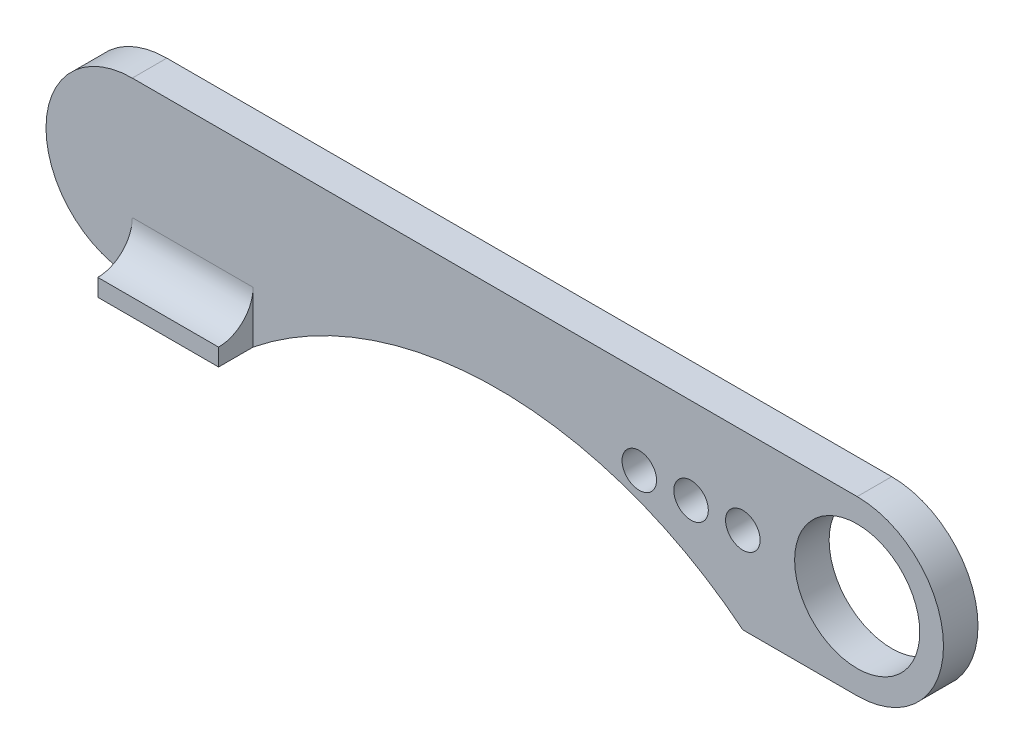
ISO-10303-21;
HEADER;
FILE_DESCRIPTION(('STEP AP214'),'2;1');
FILE_NAME('part.step','',(''),(''),'','','');
FILE_SCHEMA(('AUTOMOTIVE_DESIGN { 1 0 10303 214 1 1 1 1 }'));
ENDSEC;
DATA;
#1=APPLICATION_CONTEXT('core data for automotive mechanical design processes');
#2=APPLICATION_PROTOCOL_DEFINITION('international standard','automotive_design',2000,#1);
#3=PRODUCT_CONTEXT('',#1,'mechanical');
#4=PRODUCT('Part','Part','',(#3));
#5=PRODUCT_RELATED_PRODUCT_CATEGORY('part','',(#4));
#6=PRODUCT_DEFINITION_FORMATION('','',#4);
#7=PRODUCT_DEFINITION_CONTEXT('part definition',#1,'design');
#8=PRODUCT_DEFINITION('design','',#6,#7);
#9=PRODUCT_DEFINITION_SHAPE('','',#8);
#10=(LENGTH_UNIT() NAMED_UNIT(*) SI_UNIT(.MILLI.,.METRE.));
#11=(NAMED_UNIT(*) PLANE_ANGLE_UNIT() SI_UNIT($,.RADIAN.));
#12=(NAMED_UNIT(*) SI_UNIT($,.STERADIAN.) SOLID_ANGLE_UNIT());
#13=UNCERTAINTY_MEASURE_WITH_UNIT(LENGTH_MEASURE(1.E-05),#10,'distance_accuracy_value','');
#14=(GEOMETRIC_REPRESENTATION_CONTEXT(3) GLOBAL_UNCERTAINTY_ASSIGNED_CONTEXT((#13)) GLOBAL_UNIT_ASSIGNED_CONTEXT((#10,
#11,#12)) REPRESENTATION_CONTEXT('',''));
#15=CARTESIAN_POINT('',(0.,0.,0.));
#16=DIRECTION('',(0.,0.,1.));
#17=DIRECTION('',(1.,0.,0.));
#18=AXIS2_PLACEMENT_3D('',#15,#16,#17);
#19=CARTESIAN_POINT('',(-42.,-5.,2.));
#20=DIRECTION('',(0.,1.,0.));
#21=DIRECTION('',(-1.,0.,0.));
#22=AXIS2_PLACEMENT_3D('',#19,#20,#21);
#23=PLANE('',#22);
#24=DIRECTION('',(0.,0.,-1.));
#25=VECTOR('',#24,1.);
#26=CARTESIAN_POINT('',(-6.625,-5.,30.8121610609132));
#27=LINE('',#26,#25);
#28=CARTESIAN_POINT('',(-6.625,-5.,2.));
#29=VERTEX_POINT('',#28);
#30=CARTESIAN_POINT('',(-6.625,-5.,0.));
#31=VERTEX_POINT('',#30);
#32=EDGE_CURVE('E220',#29,#31,#27,.T.);
#33=ORIENTED_EDGE('',*,*,#32,.T.);
#34=DIRECTION('',(1.,0.,0.));
#35=VECTOR('',#34,1.);
#36=CARTESIAN_POINT('',(-42.,-5.,0.));
#37=LINE('',#36,#35);
#38=CARTESIAN_POINT('',(0.,-5.,0.));
#39=VERTEX_POINT('',#38);
#40=EDGE_CURVE('E245',#31,#39,#37,.T.);
#41=ORIENTED_EDGE('',*,*,#40,.T.);
#42=DIRECTION('',(0.,0.,-1.));
#43=VECTOR('',#42,1.);
#44=CARTESIAN_POINT('',(0.,-5.,2.));
#45=LINE('',#44,#43);
#46=CARTESIAN_POINT('',(0.,-5.,2.));
#47=VERTEX_POINT('',#46);
#48=EDGE_CURVE('E81',#47,#39,#45,.T.);
#49=ORIENTED_EDGE('',*,*,#48,.F.);
#50=DIRECTION('',(1.,0.,0.));
#51=VECTOR('',#50,1.);
#52=CARTESIAN_POINT('',(-42.,-5.,2.));
#53=LINE('',#52,#51);
#54=EDGE_CURVE('E231',#29,#47,#53,.T.);
#55=ORIENTED_EDGE('',*,*,#54,.F.);
#56=EDGE_LOOP('',(#33,#41,#49,#55));
#57=FACE_BOUND('',#56,.T.);
#58=ADVANCED_FACE('F72',(#57),#23,.F.);
#59=DIRECTION('',(0.,0.,-1.));
#60=VECTOR('',#59,1.);
#61=CARTESIAN_POINT('',(-35.,-5.,30.8121610609132));
#62=LINE('',#61,#60);
#63=CARTESIAN_POINT('',(-35.,-5.,2.));
#64=VERTEX_POINT('',#63);
#65=CARTESIAN_POINT('',(-35.,-5.00000000000001,0.));
#66=VERTEX_POINT('',#65);
#67=EDGE_CURVE('E96',#64,#66,#62,.T.);
#68=ORIENTED_EDGE('',*,*,#67,.F.);
#69=DIRECTION('',(0.,0.,1.));
#70=VECTOR('',#69,1.);
#71=CARTESIAN_POINT('',(-35.,-5.,0.));
#72=LINE('',#71,#70);
#73=CARTESIAN_POINT('',(-35.,-5.,4.));
#74=VERTEX_POINT('',#73);
#75=EDGE_CURVE('E294',#64,#74,#72,.T.);
#76=ORIENTED_EDGE('',*,*,#75,.T.);
#77=DIRECTION('',(-1.,0.,0.));
#78=VECTOR('',#77,1.);
#79=CARTESIAN_POINT('',(-42.,-5.,4.));
#80=LINE('',#79,#78);
#81=CARTESIAN_POINT('',(-42.,-5.,4.));
#82=VERTEX_POINT('',#81);
#83=EDGE_CURVE('E174',#74,#82,#80,.T.);
#84=ORIENTED_EDGE('',*,*,#83,.T.);
#85=DIRECTION('',(0.,0.,-1.));
#86=VECTOR('',#85,1.);
#87=CARTESIAN_POINT('',(-42.,-5.,0.));
#88=LINE('',#87,#86);
#89=CARTESIAN_POINT('',(-42.,-5.,2.));
#90=VERTEX_POINT('',#89);
#91=EDGE_CURVE('E161',#82,#90,#88,.T.);
#92=ORIENTED_EDGE('',*,*,#91,.T.);
#93=DIRECTION('',(0.,0.,-1.));
#94=VECTOR('',#93,1.);
#95=CARTESIAN_POINT('',(-42.,-5.,2.));
#96=LINE('',#95,#94);
#97=CARTESIAN_POINT('',(-42.,-5.,0.));
#98=VERTEX_POINT('',#97);
#99=EDGE_CURVE('E12',#90,#98,#96,.T.);
#100=ORIENTED_EDGE('',*,*,#99,.T.);
#101=EDGE_CURVE('E246',#98,#66,#37,.T.);
#102=ORIENTED_EDGE('',*,*,#101,.T.);
#103=EDGE_LOOP('',(#68,#76,#84,#92,#100,#102));
#104=FACE_BOUND('',#103,.T.);
#105=ADVANCED_FACE('F291',(#104),#23,.F.);
#106=CARTESIAN_POINT('',(-42.,0.,2.));
#107=DIRECTION('',(0.,0.,1.));
#108=DIRECTION('',(1.,0.,0.));
#109=AXIS2_PLACEMENT_3D('',#106,#107,#108);
#110=PLANE('',#109);
#111=DIRECTION('',(0.,-1.,0.));
#112=VECTOR('',#111,1.);
#113=CARTESIAN_POINT('',(-42.,0.,2.));
#114=LINE('',#113,#112);
#115=CARTESIAN_POINT('',(-42.,-2.,2.));
#116=VERTEX_POINT('',#115);
#117=EDGE_CURVE('E172',#116,#90,#114,.T.);
#118=ORIENTED_EDGE('',*,*,#117,.F.);
#119=DIRECTION('',(-1.,0.,0.));
#120=VECTOR('',#119,1.);
#121=CARTESIAN_POINT('',(-42.,-2.,2.));
#122=LINE('',#121,#120);
#123=CARTESIAN_POINT('',(-35.,-2.,2.));
#124=VERTEX_POINT('',#123);
#125=EDGE_CURVE('E146',#124,#116,#122,.T.);
#126=ORIENTED_EDGE('',*,*,#125,.F.);
#127=DIRECTION('',(0.,1.,0.));
#128=VECTOR('',#127,1.);
#129=CARTESIAN_POINT('',(-35.,0.,2.));
#130=LINE('',#129,#128);
#131=EDGE_CURVE('E167',#64,#124,#130,.T.);
#132=ORIENTED_EDGE('',*,*,#131,.F.);
#133=CARTESIAN_POINT('',(-20.8125,-22.628515625,2.));
#134=DIRECTION('',(0.,0.,1.));
#135=DIRECTION('',(1.,0.,0.));
#136=AXIS2_PLACEMENT_3D('',#133,#134,#135);
#137=CIRCLE('',#136,22.628515625);
#138=EDGE_CURVE('E193',#29,#64,#137,.T.);
#139=ORIENTED_EDGE('',*,*,#138,.F.);
#140=ORIENTED_EDGE('',*,*,#54,.T.);
#141=CARTESIAN_POINT('',(0.,0.,2.));
#142=DIRECTION('',(0.,0.,1.));
#143=DIRECTION('',(1.,0.,0.));
#144=AXIS2_PLACEMENT_3D('',#141,#142,#143);
#145=CIRCLE('',#144,5.);
#146=CARTESIAN_POINT('',(0.,5.,2.));
#147=VERTEX_POINT('',#146);
#148=EDGE_CURVE('E235',#47,#147,#145,.T.);
#149=ORIENTED_EDGE('',*,*,#148,.T.);
#150=DIRECTION('',(-1.,0.,0.));
#151=VECTOR('',#150,1.);
#152=CARTESIAN_POINT('',(-42.,5.,2.));
#153=LINE('',#152,#151);
#154=CARTESIAN_POINT('',(-42.,5.,2.));
#155=VERTEX_POINT('',#154);
#156=EDGE_CURVE('E238',#147,#155,#153,.T.);
#157=ORIENTED_EDGE('',*,*,#156,.T.);
#158=CARTESIAN_POINT('',(-42.,0.,2.));
#159=DIRECTION('',(0.,0.,1.));
#160=DIRECTION('',(1.,0.,0.));
#161=AXIS2_PLACEMENT_3D('',#158,#159,#160);
#162=CIRCLE('',#161,5.);
#163=EDGE_CURVE('E228',#155,#90,#162,.T.);
#164=ORIENTED_EDGE('',*,*,#163,.T.);
#165=EDGE_LOOP('',(#118,#126,#132,#139,#140,#149,#157,#164));
#166=FACE_BOUND('',#165,.T.);
#167=CARTESIAN_POINT('',(0.,0.,2.));
#168=DIRECTION('',(0.,0.,1.));
#169=DIRECTION('',(1.,0.,0.));
#170=AXIS2_PLACEMENT_3D('',#167,#168,#169);
#171=CIRCLE('',#170,3.625);
#172=CARTESIAN_POINT('',(3.625,0.,2.));
#173=VERTEX_POINT('',#172);
#174=EDGE_CURVE('E184',#173,#173,#171,.F.);
#175=ORIENTED_EDGE('',*,*,#174,.T.);
#176=EDGE_LOOP('',(#175));
#177=FACE_BOUND('',#176,.T.);
#178=CARTESIAN_POINT('',(-6.625,0.,2.));
#179=DIRECTION('',(0.,0.,1.));
#180=DIRECTION('',(1.,0.,0.));
#181=AXIS2_PLACEMENT_3D('',#178,#179,#180);
#182=CIRCLE('',#181,1.);
#183=CARTESIAN_POINT('',(-5.625,0.,2.));
#184=VERTEX_POINT('',#183);
#185=EDGE_CURVE('E194',#184,#184,#182,.F.);
#186=ORIENTED_EDGE('',*,*,#185,.T.);
#187=EDGE_LOOP('',(#186));
#188=FACE_BOUND('',#187,.T.);
#189=CARTESIAN_POINT('',(-9.625,0.,2.));
#190=DIRECTION('',(0.,0.,1.));
#191=DIRECTION('',(1.,0.,0.));
#192=AXIS2_PLACEMENT_3D('',#189,#190,#191);
#193=CIRCLE('',#192,1.);
#194=CARTESIAN_POINT('',(-8.625,0.,2.));
#195=VERTEX_POINT('',#194);
#196=EDGE_CURVE('E202',#195,#195,#193,.F.);
#197=ORIENTED_EDGE('',*,*,#196,.T.);
#198=EDGE_LOOP('',(#197));
#199=FACE_BOUND('',#198,.T.);
#200=CARTESIAN_POINT('',(-12.625,0.,2.));
#201=DIRECTION('',(0.,0.,1.));
#202=DIRECTION('',(1.,0.,0.));
#203=AXIS2_PLACEMENT_3D('',#200,#201,#202);
#204=CIRCLE('',#203,1.);
#205=CARTESIAN_POINT('',(-11.625,0.,2.));
#206=VERTEX_POINT('',#205);
#207=EDGE_CURVE('E183',#206,#206,#204,.F.);
#208=ORIENTED_EDGE('',*,*,#207,.T.);
#209=EDGE_LOOP('',(#208));
#210=FACE_BOUND('',#209,.T.);
#211=ADVANCED_FACE('F285',(#166,#177,#188,#199,#210),#110,.T.);
#212=CARTESIAN_POINT('',(-42.,0.,0.));
#213=DIRECTION('',(0.,0.,1.));
#214=DIRECTION('',(1.,0.,0.));
#215=AXIS2_PLACEMENT_3D('',#212,#213,#214);
#216=PLANE('',#215);
#217=ORIENTED_EDGE('',*,*,#101,.F.);
#218=CARTESIAN_POINT('',(-42.,0.,0.));
#219=DIRECTION('',(0.,0.,1.));
#220=DIRECTION('',(1.,0.,0.));
#221=AXIS2_PLACEMENT_3D('',#218,#219,#220);
#222=CIRCLE('',#221,5.);
#223=CARTESIAN_POINT('',(-42.,5.,0.));
#224=VERTEX_POINT('',#223);
#225=EDGE_CURVE('E219',#224,#98,#222,.T.);
#226=ORIENTED_EDGE('',*,*,#225,.F.);
#227=DIRECTION('',(-1.,0.,0.));
#228=VECTOR('',#227,1.);
#229=CARTESIAN_POINT('',(-42.,5.,0.));
#230=LINE('',#229,#228);
#231=CARTESIAN_POINT('',(0.,5.,0.));
#232=VERTEX_POINT('',#231);
#233=EDGE_CURVE('E232',#232,#224,#230,.T.);
#234=ORIENTED_EDGE('',*,*,#233,.F.);
#235=CARTESIAN_POINT('',(0.,0.,0.));
#236=DIRECTION('',(0.,0.,1.));
#237=DIRECTION('',(1.,0.,0.));
#238=AXIS2_PLACEMENT_3D('',#235,#236,#237);
#239=CIRCLE('',#238,5.);
#240=EDGE_CURVE('E250',#39,#232,#239,.T.);
#241=ORIENTED_EDGE('',*,*,#240,.F.);
#242=ORIENTED_EDGE('',*,*,#40,.F.);
#243=CARTESIAN_POINT('',(-20.8125,-22.628515625,0.));
#244=DIRECTION('',(0.,0.,-1.));
#245=DIRECTION('',(-1.,0.,0.));
#246=AXIS2_PLACEMENT_3D('',#243,#244,#245);
#247=CIRCLE('',#246,22.628515625);
#248=EDGE_CURVE('E216',#31,#66,#247,.F.);
#249=ORIENTED_EDGE('',*,*,#248,.T.);
#250=EDGE_LOOP('',(#217,#226,#234,#241,#242,#249));
#251=FACE_BOUND('',#250,.T.);
#252=CARTESIAN_POINT('',(-9.625,0.,0.));
#253=DIRECTION('',(0.,0.,-1.));
#254=DIRECTION('',(-1.,0.,0.));
#255=AXIS2_PLACEMENT_3D('',#252,#253,#254);
#256=CIRCLE('',#255,1.);
#257=CARTESIAN_POINT('',(-10.625,0.,0.));
#258=VERTEX_POINT('',#257);
#259=EDGE_CURVE('E198',#258,#258,#256,.T.);
#260=ORIENTED_EDGE('',*,*,#259,.F.);
#261=EDGE_LOOP('',(#260));
#262=FACE_BOUND('',#261,.T.);
#263=CARTESIAN_POINT('',(0.,0.,0.));
#264=DIRECTION('',(0.,0.,-1.));
#265=DIRECTION('',(-1.,0.,0.));
#266=AXIS2_PLACEMENT_3D('',#263,#264,#265);
#267=CIRCLE('',#266,3.625);
#268=CARTESIAN_POINT('',(-3.625,0.,0.));
#269=VERTEX_POINT('',#268);
#270=EDGE_CURVE('E188',#269,#269,#267,.T.);
#271=ORIENTED_EDGE('',*,*,#270,.F.);
#272=EDGE_LOOP('',(#271));
#273=FACE_BOUND('',#272,.T.);
#274=CARTESIAN_POINT('',(-6.625,0.,0.));
#275=DIRECTION('',(0.,0.,-1.));
#276=DIRECTION('',(-1.,0.,0.));
#277=AXIS2_PLACEMENT_3D('',#274,#275,#276);
#278=CIRCLE('',#277,1.);
#279=CARTESIAN_POINT('',(-7.625,0.,0.));
#280=VERTEX_POINT('',#279);
#281=EDGE_CURVE('E189',#280,#280,#278,.T.);
#282=ORIENTED_EDGE('',*,*,#281,.F.);
#283=EDGE_LOOP('',(#282));
#284=FACE_BOUND('',#283,.T.);
#285=CARTESIAN_POINT('',(-12.625,0.,0.));
#286=DIRECTION('',(0.,0.,-1.));
#287=DIRECTION('',(-1.,0.,0.));
#288=AXIS2_PLACEMENT_3D('',#285,#286,#287);
#289=CIRCLE('',#288,1.);
#290=CARTESIAN_POINT('',(-13.625,0.,0.));
#291=VERTEX_POINT('',#290);
#292=EDGE_CURVE('E206',#291,#291,#289,.T.);
#293=ORIENTED_EDGE('',*,*,#292,.F.);
#294=EDGE_LOOP('',(#293));
#295=FACE_BOUND('',#294,.T.);
#296=ADVANCED_FACE('F274',(#251,#262,#273,#284,#295),#216,.F.);
#297=CARTESIAN_POINT('',(-42.,0.,2.));
#298=DIRECTION('',(0.,0.,-1.));
#299=DIRECTION('',(-1.,0.,0.));
#300=AXIS2_PLACEMENT_3D('',#297,#298,#299);
#301=CYLINDRICAL_SURFACE('',#300,5.);
#302=ORIENTED_EDGE('',*,*,#225,.T.);
#303=ORIENTED_EDGE('',*,*,#99,.F.);
#304=ORIENTED_EDGE('',*,*,#163,.F.);
#305=DIRECTION('',(0.,0.,-1.));
#306=VECTOR('',#305,1.);
#307=CARTESIAN_POINT('',(-42.,5.,2.));
#308=LINE('',#307,#306);
#309=EDGE_CURVE('E241',#155,#224,#308,.T.);
#310=ORIENTED_EDGE('',*,*,#309,.T.);
#311=EDGE_LOOP('',(#302,#303,#304,#310));
#312=FACE_BOUND('',#311,.T.);
#313=ADVANCED_FACE('F74',(#312),#301,.T.);
#314=CARTESIAN_POINT('',(0.,0.,2.));
#315=DIRECTION('',(0.,0.,-1.));
#316=DIRECTION('',(-1.,0.,0.));
#317=AXIS2_PLACEMENT_3D('',#314,#315,#316);
#318=CYLINDRICAL_SURFACE('',#317,5.);
#319=ORIENTED_EDGE('',*,*,#240,.T.);
#320=DIRECTION('',(0.,0.,-1.));
#321=VECTOR('',#320,1.);
#322=CARTESIAN_POINT('',(0.,5.,2.));
#323=LINE('',#322,#321);
#324=EDGE_CURVE('E258',#147,#232,#323,.T.);
#325=ORIENTED_EDGE('',*,*,#324,.F.);
#326=ORIENTED_EDGE('',*,*,#148,.F.);
#327=ORIENTED_EDGE('',*,*,#48,.T.);
#328=EDGE_LOOP('',(#319,#325,#326,#327));
#329=FACE_BOUND('',#328,.T.);
#330=ADVANCED_FACE('F267',(#329),#318,.T.);
#331=CARTESIAN_POINT('',(-42.,5.,2.));
#332=DIRECTION('',(0.,-1.,0.));
#333=DIRECTION('',(1.,0.,0.));
#334=AXIS2_PLACEMENT_3D('',#331,#332,#333);
#335=PLANE('',#334);
#336=ORIENTED_EDGE('',*,*,#233,.T.);
#337=ORIENTED_EDGE('',*,*,#309,.F.);
#338=ORIENTED_EDGE('',*,*,#156,.F.);
#339=ORIENTED_EDGE('',*,*,#324,.T.);
#340=EDGE_LOOP('',(#336,#337,#338,#339));
#341=FACE_BOUND('',#340,.T.);
#342=ADVANCED_FACE('F279',(#341),#335,.F.);
#343=CARTESIAN_POINT('',(-20.8125,-22.628515625,30.8121610609132));
#344=DIRECTION('',(0.,0.,-1.));
#345=DIRECTION('',(-1.,0.,0.));
#346=AXIS2_PLACEMENT_3D('',#343,#344,#345);
#347=CYLINDRICAL_SURFACE('',#346,22.628515625);
#348=ORIENTED_EDGE('',*,*,#138,.T.);
#349=ORIENTED_EDGE('',*,*,#67,.T.);
#350=ORIENTED_EDGE('',*,*,#248,.F.);
#351=ORIENTED_EDGE('',*,*,#32,.F.);
#352=EDGE_LOOP('',(#348,#349,#350,#351));
#353=FACE_BOUND('',#352,.T.);
#354=ADVANCED_FACE('F289',(#353),#347,.F.);
#355=CARTESIAN_POINT('',(0.,0.,30.8121610609132));
#356=DIRECTION('',(0.,0.,-1.));
#357=DIRECTION('',(-1.,0.,0.));
#358=AXIS2_PLACEMENT_3D('',#355,#356,#357);
#359=CYLINDRICAL_SURFACE('',#358,3.625);
#360=ORIENTED_EDGE('',*,*,#270,.T.);
#361=EDGE_LOOP('',(#360));
#362=FACE_BOUND('',#361,.T.);
#363=ORIENTED_EDGE('',*,*,#174,.F.);
#364=EDGE_LOOP('',(#363));
#365=FACE_BOUND('',#364,.T.);
#366=ADVANCED_FACE('F327',(#362,#365),#359,.F.);
#367=CARTESIAN_POINT('',(-6.625,0.,30.8121610609132));
#368=DIRECTION('',(0.,0.,-1.));
#369=DIRECTION('',(-1.,0.,0.));
#370=AXIS2_PLACEMENT_3D('',#367,#368,#369);
#371=CYLINDRICAL_SURFACE('',#370,1.);
#372=ORIENTED_EDGE('',*,*,#281,.T.);
#373=EDGE_LOOP('',(#372));
#374=FACE_BOUND('',#373,.T.);
#375=ORIENTED_EDGE('',*,*,#185,.F.);
#376=EDGE_LOOP('',(#375));
#377=FACE_BOUND('',#376,.T.);
#378=ADVANCED_FACE('F335',(#374,#377),#371,.F.);
#379=CARTESIAN_POINT('',(-9.625,0.,30.8121610609132));
#380=DIRECTION('',(0.,0.,-1.));
#381=DIRECTION('',(-1.,0.,0.));
#382=AXIS2_PLACEMENT_3D('',#379,#380,#381);
#383=CYLINDRICAL_SURFACE('',#382,1.);
#384=ORIENTED_EDGE('',*,*,#259,.T.);
#385=EDGE_LOOP('',(#384));
#386=FACE_BOUND('',#385,.T.);
#387=ORIENTED_EDGE('',*,*,#196,.F.);
#388=EDGE_LOOP('',(#387));
#389=FACE_BOUND('',#388,.T.);
#390=ADVANCED_FACE('F331',(#386,#389),#383,.F.);
#391=CARTESIAN_POINT('',(-12.625,0.,30.8121610609132));
#392=DIRECTION('',(0.,0.,-1.));
#393=DIRECTION('',(-1.,0.,0.));
#394=AXIS2_PLACEMENT_3D('',#391,#392,#393);
#395=CYLINDRICAL_SURFACE('',#394,1.);
#396=ORIENTED_EDGE('',*,*,#292,.T.);
#397=EDGE_LOOP('',(#396));
#398=FACE_BOUND('',#397,.T.);
#399=ORIENTED_EDGE('',*,*,#207,.F.);
#400=EDGE_LOOP('',(#399));
#401=FACE_BOUND('',#400,.T.);
#402=ADVANCED_FACE('F328',(#398,#401),#395,.F.);
#403=CARTESIAN_POINT('',(-42.,-2.,0.));
#404=DIRECTION('',(-1.,0.,0.));
#405=DIRECTION('',(0.,-1.,0.));
#406=AXIS2_PLACEMENT_3D('',#403,#404,#405);
#407=PLANE('',#406);
#408=CARTESIAN_POINT('',(-42.,-2.,4.));
#409=DIRECTION('',(-1.,0.,0.));
#410=DIRECTION('',(0.,-1.,0.));
#411=AXIS2_PLACEMENT_3D('',#408,#409,#410);
#412=CIRCLE('',#411,2.);
#413=CARTESIAN_POINT('',(-42.,-4.,4.));
#414=VERTEX_POINT('',#413);
#415=EDGE_CURVE('E142',#116,#414,#412,.T.);
#416=ORIENTED_EDGE('',*,*,#415,.F.);
#417=ORIENTED_EDGE('',*,*,#117,.T.);
#418=ORIENTED_EDGE('',*,*,#91,.F.);
#419=DIRECTION('',(0.,-1.,0.));
#420=VECTOR('',#419,1.);
#421=CARTESIAN_POINT('',(-42.,-2.,4.));
#422=LINE('',#421,#420);
#423=EDGE_CURVE('E157',#414,#82,#422,.T.);
#424=ORIENTED_EDGE('',*,*,#423,.F.);
#425=EDGE_LOOP('',(#416,#417,#418,#424));
#426=FACE_BOUND('',#425,.T.);
#427=ADVANCED_FACE('F163',(#426),#407,.T.);
#428=CARTESIAN_POINT('',(-42.,-2.,4.));
#429=DIRECTION('',(0.,0.,1.));
#430=DIRECTION('',(1.,0.,0.));
#431=AXIS2_PLACEMENT_3D('',#428,#429,#430);
#432=PLANE('',#431);
#433=DIRECTION('',(-1.,0.,0.));
#434=VECTOR('',#433,1.);
#435=CARTESIAN_POINT('',(-29.3431457505076,-4.,4.));
#436=LINE('',#435,#434);
#437=CARTESIAN_POINT('',(-35.,-4.,4.));
#438=VERTEX_POINT('',#437);
#439=EDGE_CURVE('E145',#414,#438,#436,.F.);
#440=ORIENTED_EDGE('',*,*,#439,.F.);
#441=ORIENTED_EDGE('',*,*,#423,.T.);
#442=ORIENTED_EDGE('',*,*,#83,.F.);
#443=DIRECTION('',(0.,-1.,0.));
#444=VECTOR('',#443,1.);
#445=CARTESIAN_POINT('',(-35.,-2.,4.));
#446=LINE('',#445,#444);
#447=EDGE_CURVE('E159',#438,#74,#446,.T.);
#448=ORIENTED_EDGE('',*,*,#447,.F.);
#449=EDGE_LOOP('',(#440,#441,#442,#448));
#450=FACE_BOUND('',#449,.T.);
#451=ADVANCED_FACE('F155',(#450),#432,.T.);
#452=CARTESIAN_POINT('',(-35.,-2.,0.));
#453=DIRECTION('',(1.,0.,0.));
#454=DIRECTION('',(0.,1.,0.));
#455=AXIS2_PLACEMENT_3D('',#452,#453,#454);
#456=PLANE('',#455);
#457=CARTESIAN_POINT('',(-35.,-2.,4.));
#458=DIRECTION('',(1.,0.,0.));
#459=DIRECTION('',(0.,1.,0.));
#460=AXIS2_PLACEMENT_3D('',#457,#458,#459);
#461=CIRCLE('',#460,2.);
#462=EDGE_CURVE('E88',#124,#438,#461,.F.);
#463=ORIENTED_EDGE('',*,*,#462,.T.);
#464=ORIENTED_EDGE('',*,*,#447,.T.);
#465=ORIENTED_EDGE('',*,*,#75,.F.);
#466=ORIENTED_EDGE('',*,*,#131,.T.);
#467=EDGE_LOOP('',(#463,#464,#465,#466));
#468=FACE_BOUND('',#467,.T.);
#469=ADVANCED_FACE('F300',(#468),#456,.T.);
#470=CARTESIAN_POINT('',(-29.3431457505076,-2.,4.));
#471=DIRECTION('',(-1.,0.,0.));
#472=DIRECTION('',(0.,-1.,0.));
#473=AXIS2_PLACEMENT_3D('',#470,#471,#472);
#474=CYLINDRICAL_SURFACE('',#473,2.);
#475=ORIENTED_EDGE('',*,*,#439,.T.);
#476=ORIENTED_EDGE('',*,*,#462,.F.);
#477=ORIENTED_EDGE('',*,*,#125,.T.);
#478=ORIENTED_EDGE('',*,*,#415,.T.);
#479=EDGE_LOOP('',(#475,#476,#477,#478));
#480=FACE_BOUND('',#479,.T.);
#481=ADVANCED_FACE('F144',(#480),#474,.F.);
#482=CLOSED_SHELL('',(#58,#105,#211,#296,#313,#330,#342,#354,#366,#378,#390,#402,#427,#451,#469,#481));
#483=MANIFOLD_SOLID_BREP('B2',#482);
#484=ADVANCED_BREP_SHAPE_REPRESENTATION('',(#18,#483),#14);
#485=SHAPE_DEFINITION_REPRESENTATION(#9,#484);
ENDSEC;
END-ISO-10303-21;
